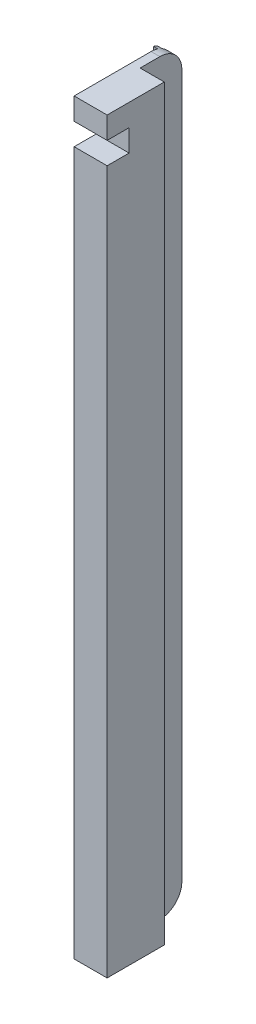
ISO-10303-21;
HEADER;
FILE_DESCRIPTION(('STEP AP214'),'2;1');
FILE_NAME('part.step','',(''),(''),'','','');
FILE_SCHEMA(('AUTOMOTIVE_DESIGN { 1 0 10303 214 1 1 1 1 }'));
ENDSEC;
DATA;
#1=APPLICATION_CONTEXT('core data for automotive mechanical design processes');
#2=APPLICATION_PROTOCOL_DEFINITION('international standard','automotive_design',2000,#1);
#3=PRODUCT_CONTEXT('',#1,'mechanical');
#4=PRODUCT('Part','Part','',(#3));
#5=PRODUCT_RELATED_PRODUCT_CATEGORY('part','',(#4));
#6=PRODUCT_DEFINITION_FORMATION('','',#4);
#7=PRODUCT_DEFINITION_CONTEXT('part definition',#1,'design');
#8=PRODUCT_DEFINITION('design','',#6,#7);
#9=PRODUCT_DEFINITION_SHAPE('','',#8);
#10=(LENGTH_UNIT() NAMED_UNIT(*) SI_UNIT(.MILLI.,.METRE.));
#11=(NAMED_UNIT(*) PLANE_ANGLE_UNIT() SI_UNIT($,.RADIAN.));
#12=(NAMED_UNIT(*) SI_UNIT($,.STERADIAN.) SOLID_ANGLE_UNIT());
#13=UNCERTAINTY_MEASURE_WITH_UNIT(LENGTH_MEASURE(1.E-05),#10,'distance_accuracy_value','');
#14=(GEOMETRIC_REPRESENTATION_CONTEXT(3) GLOBAL_UNCERTAINTY_ASSIGNED_CONTEXT((#13)) GLOBAL_UNIT_ASSIGNED_CONTEXT((#10,
#11,#12)) REPRESENTATION_CONTEXT('',''));
#15=CARTESIAN_POINT('',(0.,0.,0.));
#16=DIRECTION('',(0.,0.,1.));
#17=DIRECTION('',(1.,0.,0.));
#18=AXIS2_PLACEMENT_3D('',#15,#16,#17);
#19=CARTESIAN_POINT('',(168.,-19.9999999999999,26.));
#20=DIRECTION('',(1.,0.,0.));
#21=DIRECTION('',(0.,1.,0.));
#22=AXIS2_PLACEMENT_3D('',#19,#20,#21);
#23=PLANE('',#22);
#24=CARTESIAN_POINT('',(168.,-330.,-9.));
#25=DIRECTION('',(1.,0.,0.));
#26=DIRECTION('',(0.,1.,0.));
#27=AXIS2_PLACEMENT_3D('',#24,#25,#26);
#28=CIRCLE('',#27,10.);
#29=CARTESIAN_POINT('',(168.,-330.,-19.));
#30=VERTEX_POINT('',#29);
#31=CARTESIAN_POINT('',(168.,-338.660254037844,-14.));
#32=VERTEX_POINT('',#31);
#33=EDGE_CURVE('E258',#30,#32,#28,.F.);
#34=ORIENTED_EDGE('',*,*,#33,.T.);
#35=DIRECTION('',(0.,1.,0.));
#36=VECTOR('',#35,1.);
#37=CARTESIAN_POINT('',(168.,0.,-14.));
#38=LINE('',#37,#36);
#39=CARTESIAN_POINT('',(168.,-1.33974596215557,-14.));
#40=VERTEX_POINT('',#39);
#41=EDGE_CURVE('E156',#32,#40,#38,.T.);
#42=ORIENTED_EDGE('',*,*,#41,.T.);
#43=CARTESIAN_POINT('',(168.,-9.99999999999996,-9.));
#44=DIRECTION('',(1.,0.,0.));
#45=DIRECTION('',(0.,1.,0.));
#46=AXIS2_PLACEMENT_3D('',#43,#44,#45);
#47=CIRCLE('',#46,10.);
#48=CARTESIAN_POINT('',(168.,-9.99999999999996,-19.));
#49=VERTEX_POINT('',#48);
#50=EDGE_CURVE('E260',#40,#49,#47,.F.);
#51=ORIENTED_EDGE('',*,*,#50,.T.);
#52=DIRECTION('',(0.,1.,0.));
#53=VECTOR('',#52,1.);
#54=CARTESIAN_POINT('',(168.,0.,-19.));
#55=LINE('',#54,#53);
#56=EDGE_CURVE('E200',#30,#49,#55,.T.);
#57=ORIENTED_EDGE('',*,*,#56,.F.);
#58=EDGE_LOOP('',(#34,#42,#51,#57));
#59=FACE_BOUND('',#58,.T.);
#60=ADVANCED_FACE('F35',(#59),#23,.F.);
#61=CARTESIAN_POINT('',(0.,0.,26.));
#62=DIRECTION('',(0.,0.,1.));
#63=DIRECTION('',(1.,0.,0.));
#64=AXIS2_PLACEMENT_3D('',#61,#62,#63);
#65=PLANE('',#64);
#66=DIRECTION('',(0.,-1.,0.));
#67=VECTOR('',#66,1.);
#68=CARTESIAN_POINT('',(168.,-19.9999999999999,26.));
#69=LINE('',#68,#67);
#70=CARTESIAN_POINT('',(168.,0.,26.));
#71=VERTEX_POINT('',#70);
#72=CARTESIAN_POINT('',(168.,-9.99999999999995,26.));
#73=VERTEX_POINT('',#72);
#74=EDGE_CURVE('E228',#71,#73,#69,.T.);
#75=ORIENTED_EDGE('',*,*,#74,.T.);
#76=DIRECTION('',(-1.,0.,0.));
#77=VECTOR('',#76,1.);
#78=CARTESIAN_POINT('',(569.,-9.99999999999992,26.));
#79=LINE('',#78,#77);
#80=CARTESIAN_POINT('',(183.,-9.99999999999995,26.));
#81=VERTEX_POINT('',#80);
#82=EDGE_CURVE('E192',#81,#73,#79,.T.);
#83=ORIENTED_EDGE('',*,*,#82,.F.);
#84=DIRECTION('',(0.,-1.,0.));
#85=VECTOR('',#84,1.);
#86=CARTESIAN_POINT('',(183.,0.,26.));
#87=LINE('',#86,#85);
#88=CARTESIAN_POINT('',(183.,0.,26.));
#89=VERTEX_POINT('',#88);
#90=EDGE_CURVE('E221',#89,#81,#87,.T.);
#91=ORIENTED_EDGE('',*,*,#90,.F.);
#92=DIRECTION('',(-1.,0.,0.));
#93=VECTOR('',#92,1.);
#94=CARTESIAN_POINT('',(-168.,0.,26.));
#95=LINE('',#94,#93);
#96=EDGE_CURVE('E216',#89,#71,#95,.T.);
#97=ORIENTED_EDGE('',*,*,#96,.T.);
#98=EDGE_LOOP('',(#75,#83,#91,#97));
#99=FACE_BOUND('',#98,.T.);
#100=ADVANCED_FACE('F294',(#99),#65,.T.);
#101=CARTESIAN_POINT('',(183.,-19.9999999999999,26.));
#102=VERTEX_POINT('',#101);
#103=CARTESIAN_POINT('',(183.,-340.,26.));
#104=VERTEX_POINT('',#103);
#105=EDGE_CURVE('E219',#102,#104,#87,.T.);
#106=ORIENTED_EDGE('',*,*,#105,.F.);
#107=DIRECTION('',(-1.,0.,0.));
#108=VECTOR('',#107,1.);
#109=CARTESIAN_POINT('',(569.,-19.9999999999999,26.));
#110=LINE('',#109,#108);
#111=CARTESIAN_POINT('',(168.,-19.9999999999999,26.));
#112=VERTEX_POINT('',#111);
#113=EDGE_CURVE('E195',#102,#112,#110,.T.);
#114=ORIENTED_EDGE('',*,*,#113,.T.);
#115=CARTESIAN_POINT('',(168.,-340.,26.));
#116=VERTEX_POINT('',#115);
#117=EDGE_CURVE('E227',#112,#116,#69,.T.);
#118=ORIENTED_EDGE('',*,*,#117,.T.);
#119=DIRECTION('',(-1.,0.,0.));
#120=VECTOR('',#119,1.);
#121=CARTESIAN_POINT('',(183.,-340.,26.));
#122=LINE('',#121,#120);
#123=EDGE_CURVE('E224',#104,#116,#122,.T.);
#124=ORIENTED_EDGE('',*,*,#123,.F.);
#125=EDGE_LOOP('',(#106,#114,#118,#124));
#126=FACE_BOUND('',#125,.T.);
#127=ADVANCED_FACE('F276',(#126),#65,.T.);
#128=CARTESIAN_POINT('',(168.,0.,-9.));
#129=VERTEX_POINT('',#128);
#130=CARTESIAN_POINT('',(168.,-0.460607985830501,-12.));
#131=VERTEX_POINT('',#130);
#132=EDGE_CURVE('E261',#129,#131,#47,.F.);
#133=ORIENTED_EDGE('',*,*,#132,.T.);
#134=DIRECTION('',(0.,-1.,0.));
#135=VECTOR('',#134,1.);
#136=CARTESIAN_POINT('',(168.,0.,-12.));
#137=LINE('',#136,#135);
#138=CARTESIAN_POINT('',(168.,-339.539392014169,-12.));
#139=VERTEX_POINT('',#138);
#140=EDGE_CURVE('E172',#131,#139,#137,.T.);
#141=ORIENTED_EDGE('',*,*,#140,.T.);
#142=CARTESIAN_POINT('',(168.,-340.,-8.99999999999998));
#143=VERTEX_POINT('',#142);
#144=EDGE_CURVE('E257',#139,#143,#28,.F.);
#145=ORIENTED_EDGE('',*,*,#144,.T.);
#146=DIRECTION('',(0.,0.,-1.));
#147=VECTOR('',#146,1.);
#148=CARTESIAN_POINT('',(168.,-340.,26.));
#149=LINE('',#148,#147);
#150=EDGE_CURVE('E238',#116,#143,#149,.T.);
#151=ORIENTED_EDGE('',*,*,#150,.F.);
#152=ORIENTED_EDGE('',*,*,#117,.F.);
#153=DIRECTION('',(0.,0.,-1.));
#154=VECTOR('',#153,1.);
#155=CARTESIAN_POINT('',(168.,-20.,0.));
#156=LINE('',#155,#154);
#157=CARTESIAN_POINT('',(168.,-20.,15.9999999999999));
#158=VERTEX_POINT('',#157);
#159=EDGE_CURVE('E188',#112,#158,#156,.T.);
#160=ORIENTED_EDGE('',*,*,#159,.T.);
#161=DIRECTION('',(0.,-1.,0.));
#162=VECTOR('',#161,1.);
#163=CARTESIAN_POINT('',(168.,0.,15.9999999999999));
#164=LINE('',#163,#162);
#165=CARTESIAN_POINT('',(168.,-9.99999999999995,15.9999999999999));
#166=VERTEX_POINT('',#165);
#167=EDGE_CURVE('E186',#166,#158,#164,.T.);
#168=ORIENTED_EDGE('',*,*,#167,.F.);
#169=DIRECTION('',(0.,0.,1.));
#170=VECTOR('',#169,1.);
#171=CARTESIAN_POINT('',(168.,-9.99999999999995,0.));
#172=LINE('',#171,#170);
#173=EDGE_CURVE('E159',#166,#73,#172,.T.);
#174=ORIENTED_EDGE('',*,*,#173,.T.);
#175=ORIENTED_EDGE('',*,*,#74,.F.);
#176=DIRECTION('',(0.,0.,1.));
#177=VECTOR('',#176,1.);
#178=CARTESIAN_POINT('',(168.,0.,-19.));
#179=LINE('',#178,#177);
#180=EDGE_CURVE('E209',#129,#71,#179,.T.);
#181=ORIENTED_EDGE('',*,*,#180,.F.);
#182=EDGE_LOOP('',(#133,#141,#145,#151,#152,#160,#168,#174,#175,#181));
#183=FACE_BOUND('',#182,.T.);
#184=ADVANCED_FACE('F303',(#183),#23,.F.);
#185=CARTESIAN_POINT('',(183.,0.,26.));
#186=DIRECTION('',(1.,0.,0.));
#187=DIRECTION('',(0.,1.,0.));
#188=AXIS2_PLACEMENT_3D('',#185,#186,#187);
#189=PLANE('',#188);
#190=ORIENTED_EDGE('',*,*,#90,.T.);
#191=DIRECTION('',(0.,0.,-1.));
#192=VECTOR('',#191,1.);
#193=CARTESIAN_POINT('',(183.,-9.99999999999995,26.));
#194=LINE('',#193,#192);
#195=CARTESIAN_POINT('',(183.,-9.99999999999995,15.9999999999999));
#196=VERTEX_POINT('',#195);
#197=EDGE_CURVE('E11',#81,#196,#194,.T.);
#198=ORIENTED_EDGE('',*,*,#197,.T.);
#199=DIRECTION('',(0.,1.,0.));
#200=VECTOR('',#199,1.);
#201=CARTESIAN_POINT('',(183.,0.,15.9999999999999));
#202=LINE('',#201,#200);
#203=CARTESIAN_POINT('',(183.,-20.,15.9999999999999));
#204=VERTEX_POINT('',#203);
#205=EDGE_CURVE('E266',#204,#196,#202,.T.);
#206=ORIENTED_EDGE('',*,*,#205,.F.);
#207=DIRECTION('',(0.,0.,1.));
#208=VECTOR('',#207,1.);
#209=CARTESIAN_POINT('',(183.,-19.9999999999999,26.));
#210=LINE('',#209,#208);
#211=EDGE_CURVE('E43',#204,#102,#210,.T.);
#212=ORIENTED_EDGE('',*,*,#211,.T.);
#213=ORIENTED_EDGE('',*,*,#105,.T.);
#214=DIRECTION('',(0.,0.,-1.));
#215=VECTOR('',#214,1.);
#216=CARTESIAN_POINT('',(183.,-340.,26.));
#217=LINE('',#216,#215);
#218=CARTESIAN_POINT('',(183.,-340.,0.));
#219=VERTEX_POINT('',#218);
#220=EDGE_CURVE('E242',#104,#219,#217,.T.);
#221=ORIENTED_EDGE('',*,*,#220,.T.);
#222=DIRECTION('',(0.,-1.,0.));
#223=VECTOR('',#222,1.);
#224=CARTESIAN_POINT('',(183.,0.,0.));
#225=LINE('',#224,#223);
#226=CARTESIAN_POINT('',(183.,0.,0.));
#227=VERTEX_POINT('',#226);
#228=EDGE_CURVE('E233',#227,#219,#225,.T.);
#229=ORIENTED_EDGE('',*,*,#228,.F.);
#230=DIRECTION('',(0.,0.,-1.));
#231=VECTOR('',#230,1.);
#232=CARTESIAN_POINT('',(183.,0.,26.));
#233=LINE('',#232,#231);
#234=EDGE_CURVE('E231',#89,#227,#233,.T.);
#235=ORIENTED_EDGE('',*,*,#234,.F.);
#236=EDGE_LOOP('',(#190,#198,#206,#212,#213,#221,#229,#235));
#237=FACE_BOUND('',#236,.T.);
#238=ADVANCED_FACE('F271',(#237),#189,.T.);
#239=CARTESIAN_POINT('',(168.,0.,26.));
#240=DIRECTION('',(0.,1.,0.));
#241=DIRECTION('',(-1.,0.,0.));
#242=AXIS2_PLACEMENT_3D('',#239,#240,#241);
#243=PLANE('',#242);
#244=ORIENTED_EDGE('',*,*,#180,.T.);
#245=ORIENTED_EDGE('',*,*,#96,.F.);
#246=ORIENTED_EDGE('',*,*,#234,.T.);
#247=DIRECTION('',(1.,0.,0.));
#248=VECTOR('',#247,1.);
#249=CARTESIAN_POINT('',(168.,0.,0.));
#250=LINE('',#249,#248);
#251=CARTESIAN_POINT('',(172.,0.,0.));
#252=VERTEX_POINT('',#251);
#253=EDGE_CURVE('E212',#252,#227,#250,.T.);
#254=ORIENTED_EDGE('',*,*,#253,.F.);
#255=DIRECTION('',(0.,0.,1.));
#256=VECTOR('',#255,1.);
#257=CARTESIAN_POINT('',(172.,0.,-19.));
#258=LINE('',#257,#256);
#259=CARTESIAN_POINT('',(172.,0.,-9.));
#260=VERTEX_POINT('',#259);
#261=EDGE_CURVE('E213',#260,#252,#258,.T.);
#262=ORIENTED_EDGE('',*,*,#261,.F.);
#263=DIRECTION('',(1.,0.,0.));
#264=VECTOR('',#263,1.);
#265=CARTESIAN_POINT('',(168.,0.,-9.));
#266=LINE('',#265,#264);
#267=EDGE_CURVE('E241',#260,#129,#266,.F.);
#268=ORIENTED_EDGE('',*,*,#267,.T.);
#269=EDGE_LOOP('',(#244,#245,#246,#254,#262,#268));
#270=FACE_BOUND('',#269,.T.);
#271=ADVANCED_FACE('F291',(#270),#243,.T.);
#272=CARTESIAN_POINT('',(0.,-9.99999999999998,-9.));
#273=DIRECTION('',(-1.,0.,0.));
#274=DIRECTION('',(0.,-1.,0.));
#275=AXIS2_PLACEMENT_3D('',#272,#273,#274);
#276=CYLINDRICAL_SURFACE('',#275,10.);
#277=DIRECTION('',(1.,0.,0.));
#278=VECTOR('',#277,1.);
#279=CARTESIAN_POINT('',(172.,-9.99999999999996,-19.));
#280=LINE('',#279,#278);
#281=CARTESIAN_POINT('',(172.,-9.99999999999996,-19.));
#282=VERTEX_POINT('',#281);
#283=EDGE_CURVE('E250',#49,#282,#280,.T.);
#284=ORIENTED_EDGE('',*,*,#283,.F.);
#285=ORIENTED_EDGE('',*,*,#50,.F.);
#286=DIRECTION('',(1.,0.,0.));
#287=VECTOR('',#286,1.);
#288=CARTESIAN_POINT('',(166.,-1.33974596215557,-14.));
#289=LINE('',#288,#287);
#290=CARTESIAN_POINT('',(166.,-1.33974596215557,-14.));
#291=VERTEX_POINT('',#290);
#292=EDGE_CURVE('E178',#291,#40,#289,.T.);
#293=ORIENTED_EDGE('',*,*,#292,.F.);
#294=CARTESIAN_POINT('',(166.,-9.99999999999996,-9.));
#295=DIRECTION('',(-1.,0.,0.));
#296=DIRECTION('',(0.,-1.,0.));
#297=AXIS2_PLACEMENT_3D('',#294,#295,#296);
#298=CIRCLE('',#297,10.);
#299=CARTESIAN_POINT('',(166.,-0.460607985830501,-12.));
#300=VERTEX_POINT('',#299);
#301=EDGE_CURVE('E170',#300,#291,#298,.T.);
#302=ORIENTED_EDGE('',*,*,#301,.F.);
#303=DIRECTION('',(1.,0.,0.));
#304=VECTOR('',#303,1.);
#305=CARTESIAN_POINT('',(166.,-0.460607985830501,-12.));
#306=LINE('',#305,#304);
#307=EDGE_CURVE('E181',#300,#131,#306,.T.);
#308=ORIENTED_EDGE('',*,*,#307,.T.);
#309=ORIENTED_EDGE('',*,*,#132,.F.);
#310=ORIENTED_EDGE('',*,*,#267,.F.);
#311=CARTESIAN_POINT('',(172.,-9.99999999999996,-9.));
#312=DIRECTION('',(1.,0.,0.));
#313=DIRECTION('',(0.,1.,0.));
#314=AXIS2_PLACEMENT_3D('',#311,#312,#313);
#315=CIRCLE('',#314,10.);
#316=EDGE_CURVE('E255',#282,#260,#315,.T.);
#317=ORIENTED_EDGE('',*,*,#316,.F.);
#318=EDGE_LOOP('',(#284,#285,#293,#302,#308,#309,#310,#317));
#319=FACE_BOUND('',#318,.T.);
#320=ADVANCED_FACE('F344',(#319),#276,.T.);
#321=CARTESIAN_POINT('',(0.,-330.,-9.));
#322=DIRECTION('',(1.,0.,0.));
#323=DIRECTION('',(0.,0.,-1.));
#324=AXIS2_PLACEMENT_3D('',#321,#322,#323);
#325=CYLINDRICAL_SURFACE('',#324,10.);
#326=DIRECTION('',(-1.,0.,0.));
#327=VECTOR('',#326,1.);
#328=CARTESIAN_POINT('',(172.,-340.,-9.));
#329=LINE('',#328,#327);
#330=CARTESIAN_POINT('',(172.,-340.,-9.));
#331=VERTEX_POINT('',#330);
#332=EDGE_CURVE('E264',#143,#331,#329,.F.);
#333=ORIENTED_EDGE('',*,*,#332,.F.);
#334=ORIENTED_EDGE('',*,*,#144,.F.);
#335=DIRECTION('',(1.,0.,0.));
#336=VECTOR('',#335,1.);
#337=CARTESIAN_POINT('',(166.,-339.539392014169,-12.));
#338=LINE('',#337,#336);
#339=CARTESIAN_POINT('',(166.,-339.539392014169,-12.));
#340=VERTEX_POINT('',#339);
#341=EDGE_CURVE('E50',#340,#139,#338,.T.);
#342=ORIENTED_EDGE('',*,*,#341,.F.);
#343=CARTESIAN_POINT('',(166.,-330.,-9.));
#344=DIRECTION('',(-1.,0.,0.));
#345=DIRECTION('',(0.,-1.,0.));
#346=AXIS2_PLACEMENT_3D('',#343,#344,#345);
#347=CIRCLE('',#346,10.);
#348=CARTESIAN_POINT('',(166.,-338.660254037844,-14.));
#349=VERTEX_POINT('',#348);
#350=EDGE_CURVE('E161',#349,#340,#347,.T.);
#351=ORIENTED_EDGE('',*,*,#350,.F.);
#352=DIRECTION('',(1.,0.,0.));
#353=VECTOR('',#352,1.);
#354=CARTESIAN_POINT('',(166.,-338.660254037844,-14.));
#355=LINE('',#354,#353);
#356=EDGE_CURVE('E150',#349,#32,#355,.T.);
#357=ORIENTED_EDGE('',*,*,#356,.T.);
#358=ORIENTED_EDGE('',*,*,#33,.F.);
#359=DIRECTION('',(-1.,0.,0.));
#360=VECTOR('',#359,1.);
#361=CARTESIAN_POINT('',(168.,-330.,-19.));
#362=LINE('',#361,#360);
#363=CARTESIAN_POINT('',(172.,-330.,-19.));
#364=VERTEX_POINT('',#363);
#365=EDGE_CURVE('E247',#364,#30,#362,.T.);
#366=ORIENTED_EDGE('',*,*,#365,.F.);
#367=CARTESIAN_POINT('',(172.,-330.,-9.));
#368=DIRECTION('',(1.,0.,0.));
#369=DIRECTION('',(0.,1.,0.));
#370=AXIS2_PLACEMENT_3D('',#367,#368,#369);
#371=CIRCLE('',#370,10.);
#372=EDGE_CURVE('E253',#331,#364,#371,.T.);
#373=ORIENTED_EDGE('',*,*,#372,.F.);
#374=EDGE_LOOP('',(#333,#334,#342,#351,#357,#358,#366,#373));
#375=FACE_BOUND('',#374,.T.);
#376=ADVANCED_FACE('F37',(#375),#325,.T.);
#377=CARTESIAN_POINT('',(183.,-340.,26.));
#378=DIRECTION('',(0.,-1.,0.));
#379=DIRECTION('',(0.,0.,-1.));
#380=AXIS2_PLACEMENT_3D('',#377,#378,#379);
#381=PLANE('',#380);
#382=ORIENTED_EDGE('',*,*,#150,.T.);
#383=ORIENTED_EDGE('',*,*,#332,.T.);
#384=DIRECTION('',(0.,0.,1.));
#385=VECTOR('',#384,1.);
#386=CARTESIAN_POINT('',(172.,-340.,-19.));
#387=LINE('',#386,#385);
#388=CARTESIAN_POINT('',(172.,-340.,0.));
#389=VERTEX_POINT('',#388);
#390=EDGE_CURVE('E206',#331,#389,#387,.T.);
#391=ORIENTED_EDGE('',*,*,#390,.T.);
#392=DIRECTION('',(-1.,0.,0.));
#393=VECTOR('',#392,1.);
#394=CARTESIAN_POINT('',(183.,-340.,0.));
#395=LINE('',#394,#393);
#396=EDGE_CURVE('E220',#219,#389,#395,.T.);
#397=ORIENTED_EDGE('',*,*,#396,.F.);
#398=ORIENTED_EDGE('',*,*,#220,.F.);
#399=ORIENTED_EDGE('',*,*,#123,.T.);
#400=EDGE_LOOP('',(#382,#383,#391,#397,#398,#399));
#401=FACE_BOUND('',#400,.T.);
#402=ADVANCED_FACE('F280',(#401),#381,.T.);
#403=CARTESIAN_POINT('',(0.,0.,0.));
#404=DIRECTION('',(0.,0.,1.));
#405=DIRECTION('',(1.,0.,0.));
#406=AXIS2_PLACEMENT_3D('',#403,#404,#405);
#407=PLANE('',#406);
#408=ORIENTED_EDGE('',*,*,#396,.T.);
#409=DIRECTION('',(0.,1.,0.));
#410=VECTOR('',#409,1.);
#411=CARTESIAN_POINT('',(172.,0.,0.));
#412=LINE('',#411,#410);
#413=EDGE_CURVE('E194',#389,#252,#412,.T.);
#414=ORIENTED_EDGE('',*,*,#413,.T.);
#415=ORIENTED_EDGE('',*,*,#253,.T.);
#416=ORIENTED_EDGE('',*,*,#228,.T.);
#417=EDGE_LOOP('',(#408,#414,#415,#416));
#418=FACE_BOUND('',#417,.T.);
#419=ADVANCED_FACE('F286',(#418),#407,.F.);
#420=CARTESIAN_POINT('',(172.,0.,-19.));
#421=DIRECTION('',(1.,0.,0.));
#422=DIRECTION('',(0.,1.,0.));
#423=AXIS2_PLACEMENT_3D('',#420,#421,#422);
#424=PLANE('',#423);
#425=DIRECTION('',(0.,1.,0.));
#426=VECTOR('',#425,1.);
#427=CARTESIAN_POINT('',(172.,0.,-19.));
#428=LINE('',#427,#426);
#429=EDGE_CURVE('E203',#364,#282,#428,.T.);
#430=ORIENTED_EDGE('',*,*,#429,.T.);
#431=ORIENTED_EDGE('',*,*,#316,.T.);
#432=ORIENTED_EDGE('',*,*,#261,.T.);
#433=ORIENTED_EDGE('',*,*,#413,.F.);
#434=ORIENTED_EDGE('',*,*,#390,.F.);
#435=ORIENTED_EDGE('',*,*,#372,.T.);
#436=EDGE_LOOP('',(#430,#431,#432,#433,#434,#435));
#437=FACE_BOUND('',#436,.T.);
#438=ADVANCED_FACE('F333',(#437),#424,.T.);
#439=CARTESIAN_POINT('',(0.,0.,-19.));
#440=DIRECTION('',(0.,0.,1.));
#441=DIRECTION('',(1.,0.,0.));
#442=AXIS2_PLACEMENT_3D('',#439,#440,#441);
#443=PLANE('',#442);
#444=ORIENTED_EDGE('',*,*,#56,.T.);
#445=ORIENTED_EDGE('',*,*,#283,.T.);
#446=ORIENTED_EDGE('',*,*,#429,.F.);
#447=ORIENTED_EDGE('',*,*,#365,.T.);
#448=EDGE_LOOP('',(#444,#445,#446,#447));
#449=FACE_BOUND('',#448,.T.);
#450=ADVANCED_FACE('F312',(#449),#443,.F.);
#451=CARTESIAN_POINT('',(569.,-9.99999999999992,0.));
#452=DIRECTION('',(0.,-1.,0.));
#453=DIRECTION('',(1.,0.,0.));
#454=AXIS2_PLACEMENT_3D('',#451,#452,#453);
#455=PLANE('',#454);
#456=ORIENTED_EDGE('',*,*,#82,.T.);
#457=ORIENTED_EDGE('',*,*,#173,.F.);
#458=DIRECTION('',(-1.,0.,0.));
#459=VECTOR('',#458,1.);
#460=CARTESIAN_POINT('',(569.,-9.99999999999992,15.9999999999999));
#461=LINE('',#460,#459);
#462=EDGE_CURVE('E191',#196,#166,#461,.T.);
#463=ORIENTED_EDGE('',*,*,#462,.F.);
#464=ORIENTED_EDGE('',*,*,#197,.F.);
#465=EDGE_LOOP('',(#456,#457,#463,#464));
#466=FACE_BOUND('',#465,.T.);
#467=ADVANCED_FACE('F298',(#466),#455,.T.);
#468=CARTESIAN_POINT('',(569.,-19.9999999999999,0.));
#469=DIRECTION('',(0.,1.,0.));
#470=DIRECTION('',(0.,0.,1.));
#471=AXIS2_PLACEMENT_3D('',#468,#469,#470);
#472=PLANE('',#471);
#473=DIRECTION('',(-1.,0.,0.));
#474=VECTOR('',#473,1.);
#475=CARTESIAN_POINT('',(569.,-19.9999999999999,15.9999999999999));
#476=LINE('',#475,#474);
#477=EDGE_CURVE('E58',#204,#158,#476,.T.);
#478=ORIENTED_EDGE('',*,*,#477,.T.);
#479=ORIENTED_EDGE('',*,*,#159,.F.);
#480=ORIENTED_EDGE('',*,*,#113,.F.);
#481=ORIENTED_EDGE('',*,*,#211,.F.);
#482=EDGE_LOOP('',(#478,#479,#480,#481));
#483=FACE_BOUND('',#482,.T.);
#484=ADVANCED_FACE('F304',(#483),#472,.T.);
#485=CARTESIAN_POINT('',(569.,0.,15.9999999999999));
#486=DIRECTION('',(0.,0.,-1.));
#487=DIRECTION('',(-1.,0.,0.));
#488=AXIS2_PLACEMENT_3D('',#485,#486,#487);
#489=PLANE('',#488);
#490=ORIENTED_EDGE('',*,*,#205,.T.);
#491=ORIENTED_EDGE('',*,*,#462,.T.);
#492=ORIENTED_EDGE('',*,*,#167,.T.);
#493=ORIENTED_EDGE('',*,*,#477,.F.);
#494=EDGE_LOOP('',(#490,#491,#492,#493));
#495=FACE_BOUND('',#494,.T.);
#496=ADVANCED_FACE('F301',(#495),#489,.F.);
#497=CARTESIAN_POINT('',(166.,0.,-14.));
#498=DIRECTION('',(0.,0.,-1.));
#499=DIRECTION('',(-1.,0.,0.));
#500=AXIS2_PLACEMENT_3D('',#497,#498,#499);
#501=PLANE('',#500);
#502=ORIENTED_EDGE('',*,*,#41,.F.);
#503=ORIENTED_EDGE('',*,*,#356,.F.);
#504=DIRECTION('',(0.,1.,0.));
#505=VECTOR('',#504,1.);
#506=CARTESIAN_POINT('',(166.,0.,-14.));
#507=LINE('',#506,#505);
#508=EDGE_CURVE('E154',#349,#291,#507,.T.);
#509=ORIENTED_EDGE('',*,*,#508,.T.);
#510=ORIENTED_EDGE('',*,*,#292,.T.);
#511=EDGE_LOOP('',(#502,#503,#509,#510));
#512=FACE_BOUND('',#511,.T.);
#513=ADVANCED_FACE('F152',(#512),#501,.T.);
#514=CARTESIAN_POINT('',(166.,0.,-12.));
#515=DIRECTION('',(0.,0.,1.));
#516=DIRECTION('',(0.,-1.,0.));
#517=AXIS2_PLACEMENT_3D('',#514,#515,#516);
#518=PLANE('',#517);
#519=ORIENTED_EDGE('',*,*,#140,.F.);
#520=ORIENTED_EDGE('',*,*,#307,.F.);
#521=DIRECTION('',(0.,-1.,0.));
#522=VECTOR('',#521,1.);
#523=CARTESIAN_POINT('',(166.,0.,-12.));
#524=LINE('',#523,#522);
#525=EDGE_CURVE('E166',#300,#340,#524,.T.);
#526=ORIENTED_EDGE('',*,*,#525,.T.);
#527=ORIENTED_EDGE('',*,*,#341,.T.);
#528=EDGE_LOOP('',(#519,#520,#526,#527));
#529=FACE_BOUND('',#528,.T.);
#530=ADVANCED_FACE('F361',(#529),#518,.T.);
#531=CARTESIAN_POINT('',(166.,0.,0.));
#532=DIRECTION('',(-1.,0.,0.));
#533=DIRECTION('',(0.,-1.,0.));
#534=AXIS2_PLACEMENT_3D('',#531,#532,#533);
#535=PLANE('',#534);
#536=ORIENTED_EDGE('',*,*,#508,.F.);
#537=ORIENTED_EDGE('',*,*,#350,.T.);
#538=ORIENTED_EDGE('',*,*,#525,.F.);
#539=ORIENTED_EDGE('',*,*,#301,.T.);
#540=EDGE_LOOP('',(#536,#537,#538,#539));
#541=FACE_BOUND('',#540,.T.);
#542=ADVANCED_FACE('F168',(#541),#535,.T.);
#543=CLOSED_SHELL('',(#60,#100,#127,#184,#238,#271,#320,#376,#402,#419,#438,#450,#467,#484,#496,
#513,#530,#542));
#544=MANIFOLD_SOLID_BREP('B2',#543);
#545=ADVANCED_BREP_SHAPE_REPRESENTATION('',(#18,#544),#14);
#546=SHAPE_DEFINITION_REPRESENTATION(#9,#545);
ENDSEC;
END-ISO-10303-21;
